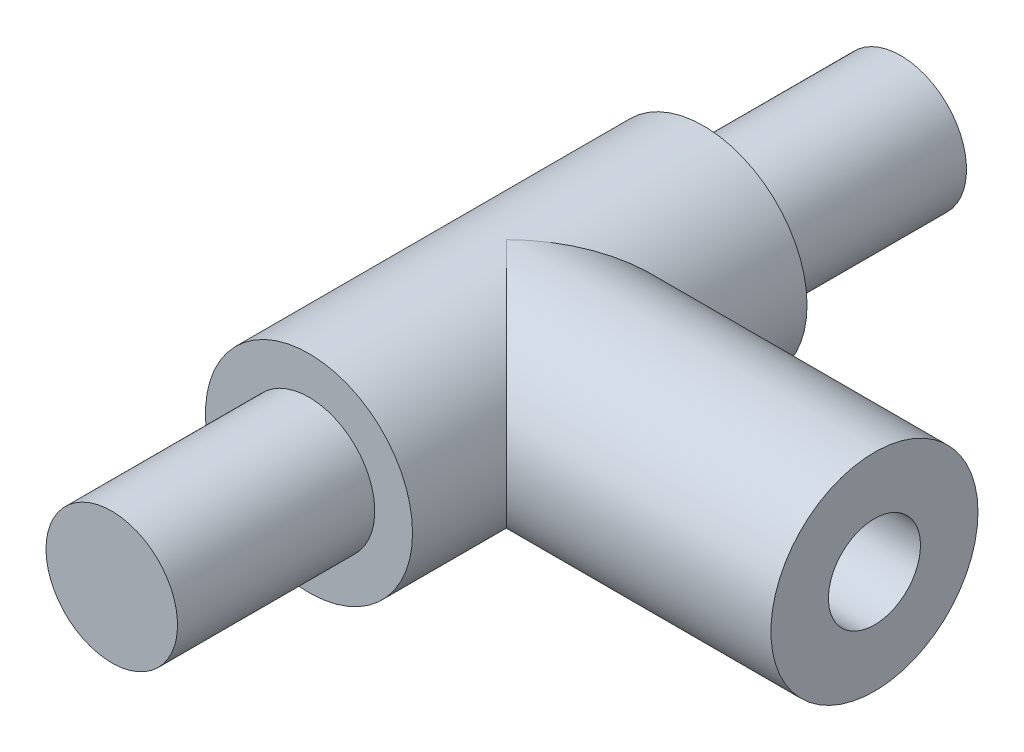
ISO-10303-21;
HEADER;
FILE_DESCRIPTION(('STEP AP214'),'2;1');
FILE_NAME('part.step','',(''),(''),'','','');
FILE_SCHEMA(('AUTOMOTIVE_DESIGN { 1 0 10303 214 1 1 1 1 }'));
ENDSEC;
DATA;
#1=APPLICATION_CONTEXT('core data for automotive mechanical design processes');
#2=APPLICATION_PROTOCOL_DEFINITION('international standard','automotive_design',2000,#1);
#3=PRODUCT_CONTEXT('',#1,'mechanical');
#4=PRODUCT('Part','Part','',(#3));
#5=PRODUCT_RELATED_PRODUCT_CATEGORY('part','',(#4));
#6=PRODUCT_DEFINITION_FORMATION('','',#4);
#7=PRODUCT_DEFINITION_CONTEXT('part definition',#1,'design');
#8=PRODUCT_DEFINITION('design','',#6,#7);
#9=PRODUCT_DEFINITION_SHAPE('','',#8);
#10=(LENGTH_UNIT() NAMED_UNIT(*) SI_UNIT(.MILLI.,.METRE.));
#11=(NAMED_UNIT(*) PLANE_ANGLE_UNIT() SI_UNIT($,.RADIAN.));
#12=(NAMED_UNIT(*) SI_UNIT($,.STERADIAN.) SOLID_ANGLE_UNIT());
#13=UNCERTAINTY_MEASURE_WITH_UNIT(LENGTH_MEASURE(1.E-05),#10,'distance_accuracy_value','');
#14=(GEOMETRIC_REPRESENTATION_CONTEXT(3) GLOBAL_UNCERTAINTY_ASSIGNED_CONTEXT((#13)) GLOBAL_UNIT_ASSIGNED_CONTEXT((#10,
#11,#12)) REPRESENTATION_CONTEXT('',''));
#15=CARTESIAN_POINT('',(0.,0.,0.));
#16=DIRECTION('',(0.,0.,1.));
#17=DIRECTION('',(1.,0.,0.));
#18=AXIS2_PLACEMENT_3D('',#15,#16,#17);
#19=CARTESIAN_POINT('',(0.,0.,9.525));
#20=DIRECTION('',(0.,0.,-1.));
#21=DIRECTION('',(-1.,0.,0.));
#22=AXIS2_PLACEMENT_3D('',#19,#20,#21);
#23=CYLINDRICAL_SURFACE('',#22,5.);
#24=CARTESIAN_POINT('',(0.,0.,-9.525));
#25=DIRECTION('',(0.,0.,1.));
#26=DIRECTION('',(1.,0.,0.));
#27=AXIS2_PLACEMENT_3D('',#24,#25,#26);
#28=CIRCLE('',#27,5.);
#29=CARTESIAN_POINT('',(5.,0.,-9.525));
#30=VERTEX_POINT('',#29);
#31=EDGE_CURVE('E53',#30,#30,#28,.T.);
#32=ORIENTED_EDGE('',*,*,#31,.T.);
#33=EDGE_LOOP('',(#32));
#34=FACE_BOUND('',#33,.T.);
#35=CARTESIAN_POINT('',(0.,0.,9.525));
#36=DIRECTION('',(0.,0.,1.));
#37=DIRECTION('',(1.,0.,0.));
#38=AXIS2_PLACEMENT_3D('',#35,#36,#37);
#39=CIRCLE('',#38,5.);
#40=CARTESIAN_POINT('',(5.,0.,9.525));
#41=VERTEX_POINT('',#40);
#42=EDGE_CURVE('E50',#41,#41,#39,.T.);
#43=ORIENTED_EDGE('',*,*,#42,.F.);
#44=EDGE_LOOP('',(#43));
#45=FACE_BOUND('',#44,.T.);
#46=CARTESIAN_POINT('',(0.,0.,0.));
#47=DIRECTION('',(-0.707106781186548,0.,-0.707106781186547));
#48=DIRECTION('',(0.707106781186548,0.,-0.707106781186547));
#49=AXIS2_PLACEMENT_3D('',#46,#47,#48);
#50=ELLIPSE('',#49,7.07106781186547,5.);
#51=CARTESIAN_POINT('',(0.,-5.,0.));
#52=VERTEX_POINT('',#51);
#53=CARTESIAN_POINT('',(0.,5.,0.));
#54=VERTEX_POINT('',#53);
#55=EDGE_CURVE('E11',#52,#54,#50,.F.);
#56=ORIENTED_EDGE('',*,*,#55,.F.);
#57=CARTESIAN_POINT('',(0.,0.,0.));
#58=DIRECTION('',(0.707106781186548,0.,-0.707106781186547));
#59=DIRECTION('',(-0.707106781186548,0.,-0.707106781186547));
#60=AXIS2_PLACEMENT_3D('',#57,#58,#59);
#61=ELLIPSE('',#60,7.07106781186547,5.);
#62=EDGE_CURVE('E40',#54,#52,#61,.T.);
#63=ORIENTED_EDGE('',*,*,#62,.F.);
#64=EDGE_LOOP('',(#56,#63));
#65=FACE_BOUND('',#64,.T.);
#66=ADVANCED_FACE('F33',(#34,#45,#65),#23,.T.);
#67=CARTESIAN_POINT('',(0.,0.,9.525));
#68=DIRECTION('',(0.,0.,1.));
#69=DIRECTION('',(1.,0.,0.));
#70=AXIS2_PLACEMENT_3D('',#67,#68,#69);
#71=PLANE('',#70);
#72=CARTESIAN_POINT('',(0.,0.,9.525));
#73=DIRECTION('',(0.,0.,1.));
#74=DIRECTION('',(1.,0.,0.));
#75=AXIS2_PLACEMENT_3D('',#72,#73,#74);
#76=CIRCLE('',#75,3.175);
#77=CARTESIAN_POINT('',(-3.175,0.,9.525));
#78=VERTEX_POINT('',#77);
#79=EDGE_CURVE('E56',#78,#78,#76,.F.);
#80=ORIENTED_EDGE('',*,*,#79,.T.);
#81=EDGE_LOOP('',(#80));
#82=FACE_BOUND('',#81,.T.);
#83=ORIENTED_EDGE('',*,*,#42,.T.);
#84=EDGE_LOOP('',(#83));
#85=FACE_BOUND('',#84,.T.);
#86=ADVANCED_FACE('F101',(#82,#85),#71,.T.);
#87=CARTESIAN_POINT('',(0.,0.,-9.525));
#88=DIRECTION('',(0.,0.,1.));
#89=DIRECTION('',(1.,0.,0.));
#90=AXIS2_PLACEMENT_3D('',#87,#88,#89);
#91=PLANE('',#90);
#92=CARTESIAN_POINT('',(0.,0.,-9.525));
#93=DIRECTION('',(0.,0.,1.));
#94=DIRECTION('',(1.,0.,0.));
#95=AXIS2_PLACEMENT_3D('',#92,#93,#94);
#96=CIRCLE('',#95,3.175);
#97=CARTESIAN_POINT('',(-3.175,0.,-9.52500000000001));
#98=VERTEX_POINT('',#97);
#99=EDGE_CURVE('E48',#98,#98,#96,.F.);
#100=ORIENTED_EDGE('',*,*,#99,.F.);
#101=EDGE_LOOP('',(#100));
#102=FACE_BOUND('',#101,.T.);
#103=ORIENTED_EDGE('',*,*,#31,.F.);
#104=EDGE_LOOP('',(#103));
#105=FACE_BOUND('',#104,.T.);
#106=ADVANCED_FACE('F106',(#102,#105),#91,.F.);
#107=CARTESIAN_POINT('',(0.,0.,-19.05));
#108=DIRECTION('',(0.,0.,1.));
#109=DIRECTION('',(1.,0.,0.));
#110=AXIS2_PLACEMENT_3D('',#107,#108,#109);
#111=PLANE('',#110);
#112=CARTESIAN_POINT('',(0.,0.,-19.05));
#113=DIRECTION('',(0.,0.,1.));
#114=DIRECTION('',(1.,0.,0.));
#115=AXIS2_PLACEMENT_3D('',#112,#113,#114);
#116=CIRCLE('',#115,3.175);
#117=CARTESIAN_POINT('',(-3.175,0.,-19.05));
#118=VERTEX_POINT('',#117);
#119=EDGE_CURVE('E62',#118,#118,#116,.T.);
#120=ORIENTED_EDGE('',*,*,#119,.F.);
#121=EDGE_LOOP('',(#120));
#122=FACE_BOUND('',#121,.T.);
#123=ADVANCED_FACE('F115',(#122),#111,.F.);
#124=CARTESIAN_POINT('',(0.,0.,19.05));
#125=DIRECTION('',(0.,0.,-1.));
#126=DIRECTION('',(-1.,0.,0.));
#127=AXIS2_PLACEMENT_3D('',#124,#125,#126);
#128=CYLINDRICAL_SURFACE('',#127,3.175);
#129=CARTESIAN_POINT('',(-3.175,0.,-19.05));
#130=CARTESIAN_POINT('',(-3.175,0.,-18.95078125));
#131=CARTESIAN_POINT('',(-3.175,0.,-18.8515625));
#132=CARTESIAN_POINT('',(-3.175,0.,-18.653125));
#133=CARTESIAN_POINT('',(-3.175,0.,-18.55390625));
#134=CARTESIAN_POINT('',(-3.175,0.,-18.35546875));
#135=CARTESIAN_POINT('',(-3.175,0.,-18.25625));
#136=CARTESIAN_POINT('',(-3.175,0.,-18.0578125));
#137=CARTESIAN_POINT('',(-3.175,0.,-17.95859375));
#138=CARTESIAN_POINT('',(-3.175,0.,-17.76015625));
#139=CARTESIAN_POINT('',(-3.175,0.,-17.6609375));
#140=CARTESIAN_POINT('',(-3.175,0.,-17.4625));
#141=CARTESIAN_POINT('',(-3.175,0.,-17.36328125));
#142=CARTESIAN_POINT('',(-3.175,0.,-17.16484375));
#143=CARTESIAN_POINT('',(-3.175,0.,-17.065625));
#144=CARTESIAN_POINT('',(-3.175,0.,-16.8671875));
#145=CARTESIAN_POINT('',(-3.175,0.,-16.76796875));
#146=CARTESIAN_POINT('',(-3.175,0.,-16.56953125));
#147=CARTESIAN_POINT('',(-3.175,0.,-16.4703125));
#148=CARTESIAN_POINT('',(-3.175,0.,-16.271875));
#149=CARTESIAN_POINT('',(-3.175,0.,-16.17265625));
#150=CARTESIAN_POINT('',(-3.175,0.,-15.97421875));
#151=CARTESIAN_POINT('',(-3.175,0.,-15.875));
#152=CARTESIAN_POINT('',(-3.175,0.,-15.6765625));
#153=CARTESIAN_POINT('',(-3.175,0.,-15.57734375));
#154=CARTESIAN_POINT('',(-3.175,0.,-15.37890625));
#155=CARTESIAN_POINT('',(-3.175,0.,-15.2796875));
#156=CARTESIAN_POINT('',(-3.175,0.,-15.08125));
#157=CARTESIAN_POINT('',(-3.175,0.,-14.98203125));
#158=CARTESIAN_POINT('',(-3.175,0.,-14.78359375));
#159=CARTESIAN_POINT('',(-3.175,0.,-14.684375));
#160=CARTESIAN_POINT('',(-3.175,0.,-14.4859375));
#161=CARTESIAN_POINT('',(-3.175,0.,-14.38671875));
#162=CARTESIAN_POINT('',(-3.175,0.,-14.18828125));
#163=CARTESIAN_POINT('',(-3.175,0.,-14.0890625));
#164=CARTESIAN_POINT('',(-3.175,0.,-13.890625));
#165=CARTESIAN_POINT('',(-3.175,0.,-13.79140625));
#166=CARTESIAN_POINT('',(-3.175,0.,-13.59296875));
#167=CARTESIAN_POINT('',(-3.175,0.,-13.49375));
#168=CARTESIAN_POINT('',(-3.175,0.,-13.2953125));
#169=CARTESIAN_POINT('',(-3.175,0.,-13.19609375));
#170=CARTESIAN_POINT('',(-3.175,0.,-12.99765625));
#171=CARTESIAN_POINT('',(-3.175,0.,-12.8984375));
#172=CARTESIAN_POINT('',(-3.175,0.,-12.7));
#173=CARTESIAN_POINT('',(-3.175,0.,-12.60078125));
#174=CARTESIAN_POINT('',(-3.175,0.,-12.40234375));
#175=CARTESIAN_POINT('',(-3.175,0.,-12.303125));
#176=CARTESIAN_POINT('',(-3.175,0.,-12.1046875));
#177=CARTESIAN_POINT('',(-3.175,0.,-12.00546875));
#178=CARTESIAN_POINT('',(-3.175,0.,-11.80703125));
#179=CARTESIAN_POINT('',(-3.175,0.,-11.7078125));
#180=CARTESIAN_POINT('',(-3.175,0.,-11.509375));
#181=CARTESIAN_POINT('',(-3.175,0.,-11.41015625));
#182=CARTESIAN_POINT('',(-3.175,0.,-11.21171875));
#183=CARTESIAN_POINT('',(-3.175,0.,-11.1125));
#184=CARTESIAN_POINT('',(-3.175,0.,-10.9140625));
#185=CARTESIAN_POINT('',(-3.175,0.,-10.81484375));
#186=CARTESIAN_POINT('',(-3.175,0.,-10.61640625));
#187=CARTESIAN_POINT('',(-3.175,0.,-10.5171875));
#188=CARTESIAN_POINT('',(-3.175,0.,-10.31875));
#189=CARTESIAN_POINT('',(-3.175,0.,-10.21953125));
#190=CARTESIAN_POINT('',(-3.175,0.,-10.02109375));
#191=CARTESIAN_POINT('',(-3.175,0.,-9.92187500000001));
#192=CARTESIAN_POINT('',(-3.175,0.,-9.72343750000001));
#193=CARTESIAN_POINT('',(-3.175,0.,-9.62421875000001));
#194=CARTESIAN_POINT('',(-3.175,0.,-9.52500000000001));
#195=B_SPLINE_CURVE_WITH_KNOTS('',3,(#129,#130,#131,#132,#133,#134,#135,#136,#137,#138,#139,
#140,#141,#142,#143,#144,#145,#146,#147,#148,#149,#150,#151,#152,#153,#154,#155,#156,#157,#158,
#159,#160,#161,#162,#163,#164,#165,#166,#167,#168,#169,#170,#171,#172,#173,#174,#175,#176,#177,
#178,#179,#180,#181,#182,#183,#184,#185,#186,#187,#188,#189,#190,#191,#192,#193,#194),
.UNSPECIFIED.,.F.,.F.,(4,2,2,2,2,2,2,2,2,2,2,2,2,2,2,2,2,2,2,2,2,2,2,2,2,2,2,2,2,2,2,2,4),(0.,
0.29765625,0.5953125,0.892968750000001,1.190625,1.48828125,1.7859375,2.08359375,2.38125,
2.67890625,2.9765625,3.27421875,3.571875,3.86953125,4.1671875,4.46484375,4.7625,5.06015625,
5.3578125,5.65546875,5.953125,6.25078125,6.5484375,6.84609375,7.14374999999999,7.44140624999999,
7.73906249999999,8.03671875,8.33437499999999,8.63203125,8.92968749999999,9.22734375,9.525),.UNSPECIFIED.);
#196=EDGE_CURVE('BSEAM120',#118,#98,#195,.T.);
#197=ORIENTED_EDGE('',*,*,#119,.T.);
#198=ORIENTED_EDGE('',*,*,#99,.T.);
#199=ORIENTED_EDGE('',*,*,#196,.T.);
#200=ORIENTED_EDGE('',*,*,#196,.F.);
#201=EDGE_LOOP('',(#197,#199,#198,#200));
#202=FACE_BOUND('',#201,.T.);
#203=ADVANCED_FACE('F120',(#202),#128,.T.);
#204=CARTESIAN_POINT('',(0.,0.,19.05));
#205=DIRECTION('',(0.,0.,1.));
#206=DIRECTION('',(1.,0.,0.));
#207=AXIS2_PLACEMENT_3D('',#204,#205,#206);
#208=CIRCLE('',#207,3.175);
#209=CARTESIAN_POINT('',(-3.175,0.,19.05));
#210=VERTEX_POINT('',#209);
#211=EDGE_CURVE('E61',#210,#210,#208,.T.);
#212=CARTESIAN_POINT('',(-3.175,0.,9.525));
#213=CARTESIAN_POINT('',(-3.175,0.,9.62421875));
#214=CARTESIAN_POINT('',(-3.175,0.,9.7234375));
#215=CARTESIAN_POINT('',(-3.175,0.,9.921875));
#216=CARTESIAN_POINT('',(-3.175,0.,10.02109375));
#217=CARTESIAN_POINT('',(-3.175,0.,10.21953125));
#218=CARTESIAN_POINT('',(-3.175,0.,10.31875));
#219=CARTESIAN_POINT('',(-3.175,0.,10.5171875));
#220=CARTESIAN_POINT('',(-3.175,0.,10.61640625));
#221=CARTESIAN_POINT('',(-3.175,0.,10.81484375));
#222=CARTESIAN_POINT('',(-3.175,0.,10.9140625));
#223=CARTESIAN_POINT('',(-3.175,0.,11.1125));
#224=CARTESIAN_POINT('',(-3.175,0.,11.21171875));
#225=CARTESIAN_POINT('',(-3.175,0.,11.41015625));
#226=CARTESIAN_POINT('',(-3.175,0.,11.509375));
#227=CARTESIAN_POINT('',(-3.175,0.,11.7078125));
#228=CARTESIAN_POINT('',(-3.175,0.,11.80703125));
#229=CARTESIAN_POINT('',(-3.175,0.,12.00546875));
#230=CARTESIAN_POINT('',(-3.175,0.,12.1046875));
#231=CARTESIAN_POINT('',(-3.175,0.,12.303125));
#232=CARTESIAN_POINT('',(-3.175,0.,12.40234375));
#233=CARTESIAN_POINT('',(-3.175,0.,12.60078125));
#234=CARTESIAN_POINT('',(-3.175,0.,12.7));
#235=CARTESIAN_POINT('',(-3.175,0.,12.8984375));
#236=CARTESIAN_POINT('',(-3.175,0.,12.99765625));
#237=CARTESIAN_POINT('',(-3.175,0.,13.19609375));
#238=CARTESIAN_POINT('',(-3.175,0.,13.2953125));
#239=CARTESIAN_POINT('',(-3.175,0.,13.49375));
#240=CARTESIAN_POINT('',(-3.175,0.,13.59296875));
#241=CARTESIAN_POINT('',(-3.175,0.,13.79140625));
#242=CARTESIAN_POINT('',(-3.175,0.,13.890625));
#243=CARTESIAN_POINT('',(-3.175,0.,14.0890625));
#244=CARTESIAN_POINT('',(-3.175,0.,14.18828125));
#245=CARTESIAN_POINT('',(-3.175,0.,14.38671875));
#246=CARTESIAN_POINT('',(-3.175,0.,14.4859375));
#247=CARTESIAN_POINT('',(-3.175,0.,14.684375));
#248=CARTESIAN_POINT('',(-3.175,0.,14.78359375));
#249=CARTESIAN_POINT('',(-3.175,0.,14.98203125));
#250=CARTESIAN_POINT('',(-3.175,0.,15.08125));
#251=CARTESIAN_POINT('',(-3.175,0.,15.2796875));
#252=CARTESIAN_POINT('',(-3.175,0.,15.37890625));
#253=CARTESIAN_POINT('',(-3.175,0.,15.57734375));
#254=CARTESIAN_POINT('',(-3.175,0.,15.6765625));
#255=CARTESIAN_POINT('',(-3.175,0.,15.875));
#256=CARTESIAN_POINT('',(-3.175,0.,15.97421875));
#257=CARTESIAN_POINT('',(-3.175,0.,16.17265625));
#258=CARTESIAN_POINT('',(-3.175,0.,16.271875));
#259=CARTESIAN_POINT('',(-3.175,0.,16.4703125));
#260=CARTESIAN_POINT('',(-3.175,0.,16.56953125));
#261=CARTESIAN_POINT('',(-3.175,0.,16.76796875));
#262=CARTESIAN_POINT('',(-3.175,0.,16.8671875));
#263=CARTESIAN_POINT('',(-3.175,0.,17.065625));
#264=CARTESIAN_POINT('',(-3.175,0.,17.16484375));
#265=CARTESIAN_POINT('',(-3.175,0.,17.36328125));
#266=CARTESIAN_POINT('',(-3.175,0.,17.4625));
#267=CARTESIAN_POINT('',(-3.175,0.,17.6609375));
#268=CARTESIAN_POINT('',(-3.175,0.,17.76015625));
#269=CARTESIAN_POINT('',(-3.175,0.,17.95859375));
#270=CARTESIAN_POINT('',(-3.175,0.,18.0578125));
#271=CARTESIAN_POINT('',(-3.175,0.,18.25625));
#272=CARTESIAN_POINT('',(-3.175,0.,18.35546875));
#273=CARTESIAN_POINT('',(-3.175,0.,18.55390625));
#274=CARTESIAN_POINT('',(-3.175,0.,18.653125));
#275=CARTESIAN_POINT('',(-3.175,0.,18.8515625));
#276=CARTESIAN_POINT('',(-3.175,0.,18.95078125));
#277=CARTESIAN_POINT('',(-3.175,0.,19.05));
#278=B_SPLINE_CURVE_WITH_KNOTS('',3,(#212,#213,#214,#215,#216,#217,#218,#219,#220,#221,#222,
#223,#224,#225,#226,#227,#228,#229,#230,#231,#232,#233,#234,#235,#236,#237,#238,#239,#240,#241,
#242,#243,#244,#245,#246,#247,#248,#249,#250,#251,#252,#253,#254,#255,#256,#257,#258,#259,#260,
#261,#262,#263,#264,#265,#266,#267,#268,#269,#270,#271,#272,#273,#274,#275,#276,#277),
.UNSPECIFIED.,.F.,.F.,(4,2,2,2,2,2,2,2,2,2,2,2,2,2,2,2,2,2,2,2,2,2,2,2,2,2,2,2,2,2,2,2,4),(0.,
0.29765625,0.5953125,0.892968750000001,1.190625,1.48828125,1.7859375,2.08359375,2.38125,
2.67890625,2.9765625,3.27421875,3.571875,3.86953125,4.1671875,4.46484375,4.7625,5.06015625,
5.3578125,5.65546875,5.953125,6.25078125,6.5484375,6.84609375,7.14375,7.44140625,7.7390625,
8.03671875,8.334375,8.63203125,8.9296875,9.22734375,9.525),.UNSPECIFIED.);
#279=EDGE_CURVE('BSEAM97',#78,#210,#278,.T.);
#280=ORIENTED_EDGE('',*,*,#79,.F.);
#281=ORIENTED_EDGE('',*,*,#211,.F.);
#282=ORIENTED_EDGE('',*,*,#279,.T.);
#283=ORIENTED_EDGE('',*,*,#279,.F.);
#284=EDGE_LOOP('',(#280,#282,#281,#283));
#285=FACE_BOUND('',#284,.T.);
#286=ADVANCED_FACE('F97',(#285),#128,.T.);
#287=CARTESIAN_POINT('',(0.,0.,19.05));
#288=DIRECTION('',(0.,0.,1.));
#289=DIRECTION('',(1.,0.,0.));
#290=AXIS2_PLACEMENT_3D('',#287,#288,#289);
#291=PLANE('',#290);
#292=ORIENTED_EDGE('',*,*,#211,.T.);
#293=EDGE_LOOP('',(#292));
#294=FACE_BOUND('',#293,.T.);
#295=ADVANCED_FACE('F92',(#294),#291,.T.);
#296=CARTESIAN_POINT('',(17.78,0.,0.));
#297=DIRECTION('',(-1.,0.,0.));
#298=DIRECTION('',(0.,0.,1.));
#299=AXIS2_PLACEMENT_3D('',#296,#297,#298);
#300=CYLINDRICAL_SURFACE('',#299,5.);
#301=CARTESIAN_POINT('',(17.78,0.,0.));
#302=DIRECTION('',(1.,0.,0.));
#303=DIRECTION('',(0.,0.,-1.));
#304=AXIS2_PLACEMENT_3D('',#301,#302,#303);
#305=CIRCLE('',#304,5.);
#306=CARTESIAN_POINT('',(17.78,0.,-5.));
#307=VERTEX_POINT('',#306);
#308=EDGE_CURVE('E65',#307,#307,#305,.T.);
#309=ORIENTED_EDGE('',*,*,#308,.F.);
#310=EDGE_LOOP('',(#309));
#311=FACE_BOUND('',#310,.T.);
#312=ORIENTED_EDGE('',*,*,#62,.T.);
#313=ORIENTED_EDGE('',*,*,#55,.T.);
#314=EDGE_LOOP('',(#312,#313));
#315=FACE_BOUND('',#314,.T.);
#316=ADVANCED_FACE('F47',(#311,#315),#300,.T.);
#317=CARTESIAN_POINT('',(17.78,0.,0.));
#318=DIRECTION('',(1.,0.,0.));
#319=DIRECTION('',(0.,0.,-1.));
#320=AXIS2_PLACEMENT_3D('',#317,#318,#319);
#321=PLANE('',#320);
#322=CARTESIAN_POINT('',(17.78,0.,0.));
#323=DIRECTION('',(1.,0.,0.));
#324=DIRECTION('',(0.,0.,-1.));
#325=AXIS2_PLACEMENT_3D('',#322,#323,#324);
#326=CIRCLE('',#325,2.2225);
#327=CARTESIAN_POINT('',(17.78,0.,-2.2225));
#328=VERTEX_POINT('',#327);
#329=EDGE_CURVE('E71',#328,#328,#326,.T.);
#330=ORIENTED_EDGE('',*,*,#329,.F.);
#331=EDGE_LOOP('',(#330));
#332=FACE_BOUND('',#331,.T.);
#333=ORIENTED_EDGE('',*,*,#308,.T.);
#334=EDGE_LOOP('',(#333));
#335=FACE_BOUND('',#334,.T.);
#336=ADVANCED_FACE('F82',(#332,#335),#321,.T.);
#337=CARTESIAN_POINT('',(5.08,0.,0.));
#338=DIRECTION('',(1.,0.,0.));
#339=DIRECTION('',(0.,0.,-1.));
#340=AXIS2_PLACEMENT_3D('',#337,#338,#339);
#341=CYLINDRICAL_SURFACE('',#340,2.2225);
#342=CARTESIAN_POINT('',(5.08,0.,0.));
#343=DIRECTION('',(1.,0.,0.));
#344=DIRECTION('',(0.,0.,-1.));
#345=AXIS2_PLACEMENT_3D('',#342,#343,#344);
#346=CIRCLE('',#345,2.2225);
#347=CARTESIAN_POINT('',(5.08,0.,-2.2225));
#348=VERTEX_POINT('',#347);
#349=EDGE_CURVE('E70',#348,#348,#346,.T.);
#350=ORIENTED_EDGE('',*,*,#349,.F.);
#351=EDGE_LOOP('',(#350));
#352=FACE_BOUND('',#351,.T.);
#353=ORIENTED_EDGE('',*,*,#329,.T.);
#354=EDGE_LOOP('',(#353));
#355=FACE_BOUND('',#354,.T.);
#356=ADVANCED_FACE('F79',(#352,#355),#341,.F.);
#357=CARTESIAN_POINT('',(5.08,0.,0.));
#358=DIRECTION('',(1.,0.,0.));
#359=DIRECTION('',(0.,0.,-1.));
#360=AXIS2_PLACEMENT_3D('',#357,#358,#359);
#361=PLANE('',#360);
#362=ORIENTED_EDGE('',*,*,#349,.T.);
#363=EDGE_LOOP('',(#362));
#364=FACE_BOUND('',#363,.T.);
#365=ADVANCED_FACE('F77',(#364),#361,.T.);
#366=CLOSED_SHELL('',(#66,#86,#106,#123,#203,#286,#295,#316,#336,#356,#365));
#367=MANIFOLD_SOLID_BREP('B2',#366);
#368=ADVANCED_BREP_SHAPE_REPRESENTATION('',(#18,#367),#14);
#369=SHAPE_DEFINITION_REPRESENTATION(#9,#368);
ENDSEC;
END-ISO-10303-21;
